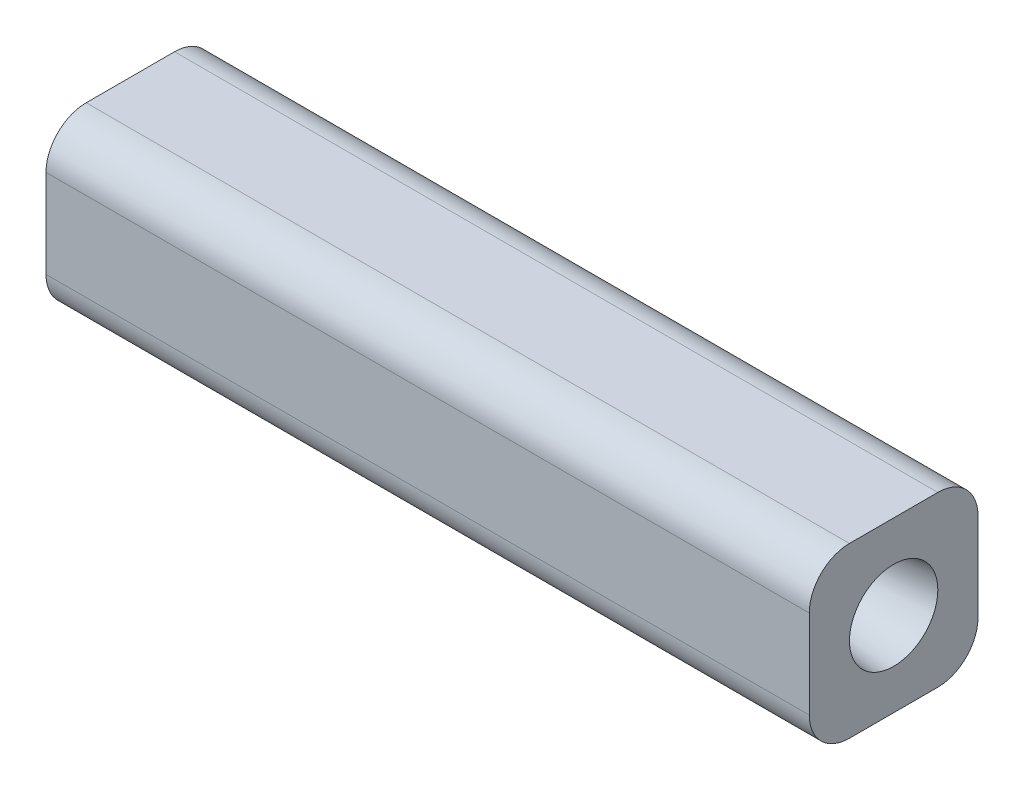
ISO-10303-21;
HEADER;
FILE_DESCRIPTION(('STEP AP214'),'2;1');
FILE_NAME('part.step','',(''),(''),'','','');
FILE_SCHEMA(('AUTOMOTIVE_DESIGN { 1 0 10303 214 1 1 1 1 }'));
ENDSEC;
DATA;
#1=APPLICATION_CONTEXT('core data for automotive mechanical design processes');
#2=APPLICATION_PROTOCOL_DEFINITION('international standard','automotive_design',2000,#1);
#3=PRODUCT_CONTEXT('',#1,'mechanical');
#4=PRODUCT('Part','Part','',(#3));
#5=PRODUCT_RELATED_PRODUCT_CATEGORY('part','',(#4));
#6=PRODUCT_DEFINITION_FORMATION('','',#4);
#7=PRODUCT_DEFINITION_CONTEXT('part definition',#1,'design');
#8=PRODUCT_DEFINITION('design','',#6,#7);
#9=PRODUCT_DEFINITION_SHAPE('','',#8);
#10=(LENGTH_UNIT() NAMED_UNIT(*) SI_UNIT(.MILLI.,.METRE.));
#11=(NAMED_UNIT(*) PLANE_ANGLE_UNIT() SI_UNIT($,.RADIAN.));
#12=(NAMED_UNIT(*) SI_UNIT($,.STERADIAN.) SOLID_ANGLE_UNIT());
#13=UNCERTAINTY_MEASURE_WITH_UNIT(LENGTH_MEASURE(1.E-05),#10,'distance_accuracy_value','');
#14=(GEOMETRIC_REPRESENTATION_CONTEXT(3) GLOBAL_UNCERTAINTY_ASSIGNED_CONTEXT((#13)) GLOBAL_UNIT_ASSIGNED_CONTEXT((#10,
#11,#12)) REPRESENTATION_CONTEXT('',''));
#15=CARTESIAN_POINT('',(0.,0.,0.));
#16=DIRECTION('',(0.,0.,1.));
#17=DIRECTION('',(1.,0.,0.));
#18=AXIS2_PLACEMENT_3D('',#15,#16,#17);
#19=CARTESIAN_POINT('',(19.,3.2,0.999999999999999));
#20=DIRECTION('',(-1.,0.,0.));
#21=DIRECTION('',(0.,0.,1.));
#22=AXIS2_PLACEMENT_3D('',#19,#20,#21);
#23=CYLINDRICAL_SURFACE('',#22,1.);
#24=CARTESIAN_POINT('',(0.,3.2,0.999999999999999));
#25=DIRECTION('',(1.,0.,0.));
#26=DIRECTION('',(0.,0.,-1.));
#27=AXIS2_PLACEMENT_3D('',#24,#25,#26);
#28=CIRCLE('',#27,1.);
#29=CARTESIAN_POINT('',(0.,3.2,0.));
#30=VERTEX_POINT('',#29);
#31=CARTESIAN_POINT('',(0.,4.2,0.999999999999999));
#32=VERTEX_POINT('',#31);
#33=EDGE_CURVE('E136',#30,#32,#28,.T.);
#34=ORIENTED_EDGE('',*,*,#33,.T.);
#35=DIRECTION('',(-1.,0.,0.));
#36=VECTOR('',#35,1.);
#37=CARTESIAN_POINT('',(19.,4.2,0.999999999999999));
#38=LINE('',#37,#36);
#39=CARTESIAN_POINT('',(19.,4.2,0.999999999999999));
#40=VERTEX_POINT('',#39);
#41=EDGE_CURVE('E11',#40,#32,#38,.T.);
#42=ORIENTED_EDGE('',*,*,#41,.F.);
#43=CARTESIAN_POINT('',(19.,3.2,0.999999999999999));
#44=DIRECTION('',(1.,0.,0.));
#45=DIRECTION('',(0.,0.,-1.));
#46=AXIS2_PLACEMENT_3D('',#43,#44,#45);
#47=CIRCLE('',#46,1.);
#48=CARTESIAN_POINT('',(19.,3.2,0.));
#49=VERTEX_POINT('',#48);
#50=EDGE_CURVE('E156',#49,#40,#47,.T.);
#51=ORIENTED_EDGE('',*,*,#50,.F.);
#52=DIRECTION('',(-1.,0.,0.));
#53=VECTOR('',#52,1.);
#54=CARTESIAN_POINT('',(19.,3.2,0.));
#55=LINE('',#54,#53);
#56=EDGE_CURVE('E132',#49,#30,#55,.T.);
#57=ORIENTED_EDGE('',*,*,#56,.T.);
#58=EDGE_LOOP('',(#34,#42,#51,#57));
#59=FACE_BOUND('',#58,.T.);
#60=ADVANCED_FACE('F41',(#59),#23,.T.);
#61=CARTESIAN_POINT('',(19.,4.2,0.999999999999999));
#62=DIRECTION('',(0.,-1.,0.));
#63=DIRECTION('',(0.,0.,-1.));
#64=AXIS2_PLACEMENT_3D('',#61,#62,#63);
#65=PLANE('',#64);
#66=DIRECTION('',(0.,0.,1.));
#67=VECTOR('',#66,1.);
#68=CARTESIAN_POINT('',(0.,4.2,0.999999999999999));
#69=LINE('',#68,#67);
#70=CARTESIAN_POINT('',(0.,4.2,3.2));
#71=VERTEX_POINT('',#70);
#72=EDGE_CURVE('E139',#32,#71,#69,.T.);
#73=ORIENTED_EDGE('',*,*,#72,.T.);
#74=DIRECTION('',(-1.,0.,0.));
#75=VECTOR('',#74,1.);
#76=CARTESIAN_POINT('',(19.,4.2,3.2));
#77=LINE('',#76,#75);
#78=CARTESIAN_POINT('',(19.,4.2,3.2));
#79=VERTEX_POINT('',#78);
#80=EDGE_CURVE('E49',#79,#71,#77,.T.);
#81=ORIENTED_EDGE('',*,*,#80,.F.);
#82=DIRECTION('',(0.,0.,1.));
#83=VECTOR('',#82,1.);
#84=CARTESIAN_POINT('',(19.,4.2,0.999999999999999));
#85=LINE('',#84,#83);
#86=EDGE_CURVE('E96',#40,#79,#85,.T.);
#87=ORIENTED_EDGE('',*,*,#86,.F.);
#88=ORIENTED_EDGE('',*,*,#41,.T.);
#89=EDGE_LOOP('',(#73,#81,#87,#88));
#90=FACE_BOUND('',#89,.T.);
#91=ADVANCED_FACE('F169',(#90),#65,.F.);
#92=CARTESIAN_POINT('',(19.,3.2,3.2));
#93=DIRECTION('',(-1.,0.,0.));
#94=DIRECTION('',(0.,0.,1.));
#95=AXIS2_PLACEMENT_3D('',#92,#93,#94);
#96=CYLINDRICAL_SURFACE('',#95,1.);
#97=CARTESIAN_POINT('',(0.,3.2,3.2));
#98=DIRECTION('',(-1.,0.,0.));
#99=DIRECTION('',(0.,0.,1.));
#100=AXIS2_PLACEMENT_3D('',#97,#98,#99);
#101=CIRCLE('',#100,1.);
#102=CARTESIAN_POINT('',(0.,3.2,4.2));
#103=VERTEX_POINT('',#102);
#104=EDGE_CURVE('E143',#103,#71,#101,.T.);
#105=ORIENTED_EDGE('',*,*,#104,.F.);
#106=DIRECTION('',(-1.,0.,0.));
#107=VECTOR('',#106,1.);
#108=CARTESIAN_POINT('',(19.,3.2,4.2));
#109=LINE('',#108,#107);
#110=CARTESIAN_POINT('',(19.,3.2,4.2));
#111=VERTEX_POINT('',#110);
#112=EDGE_CURVE('E162',#111,#103,#109,.T.);
#113=ORIENTED_EDGE('',*,*,#112,.F.);
#114=CARTESIAN_POINT('',(19.,3.2,3.2));
#115=DIRECTION('',(-1.,0.,0.));
#116=DIRECTION('',(0.,0.,1.));
#117=AXIS2_PLACEMENT_3D('',#114,#115,#116);
#118=CIRCLE('',#117,1.);
#119=EDGE_CURVE('E168',#111,#79,#118,.T.);
#120=ORIENTED_EDGE('',*,*,#119,.T.);
#121=ORIENTED_EDGE('',*,*,#80,.T.);
#122=EDGE_LOOP('',(#105,#113,#120,#121));
#123=FACE_BOUND('',#122,.T.);
#124=ADVANCED_FACE('F166',(#123),#96,.T.);
#125=CARTESIAN_POINT('',(19.,1.,4.2));
#126=DIRECTION('',(0.,0.,1.));
#127=DIRECTION('',(0.,-1.,0.));
#128=AXIS2_PLACEMENT_3D('',#125,#126,#127);
#129=PLANE('',#128);
#130=DIRECTION('',(0.,1.,0.));
#131=VECTOR('',#130,1.);
#132=CARTESIAN_POINT('',(0.,1.,4.2));
#133=LINE('',#132,#131);
#134=CARTESIAN_POINT('',(0.,1.,4.2));
#135=VERTEX_POINT('',#134);
#136=EDGE_CURVE('E146',#135,#103,#133,.T.);
#137=ORIENTED_EDGE('',*,*,#136,.F.);
#138=DIRECTION('',(-1.,0.,0.));
#139=VECTOR('',#138,1.);
#140=CARTESIAN_POINT('',(19.,1.,4.2));
#141=LINE('',#140,#139);
#142=CARTESIAN_POINT('',(19.,1.,4.2));
#143=VERTEX_POINT('',#142);
#144=EDGE_CURVE('E160',#143,#135,#141,.T.);
#145=ORIENTED_EDGE('',*,*,#144,.F.);
#146=DIRECTION('',(0.,1.,0.));
#147=VECTOR('',#146,1.);
#148=CARTESIAN_POINT('',(19.,1.,4.2));
#149=LINE('',#148,#147);
#150=EDGE_CURVE('E179',#143,#111,#149,.T.);
#151=ORIENTED_EDGE('',*,*,#150,.T.);
#152=ORIENTED_EDGE('',*,*,#112,.T.);
#153=EDGE_LOOP('',(#137,#145,#151,#152));
#154=FACE_BOUND('',#153,.T.);
#155=ADVANCED_FACE('F177',(#154),#129,.T.);
#156=CARTESIAN_POINT('',(19.,1.,3.2));
#157=DIRECTION('',(-1.,0.,0.));
#158=DIRECTION('',(0.,0.,1.));
#159=AXIS2_PLACEMENT_3D('',#156,#157,#158);
#160=CYLINDRICAL_SURFACE('',#159,1.);
#161=CARTESIAN_POINT('',(0.,1.,3.2));
#162=DIRECTION('',(-1.,0.,0.));
#163=DIRECTION('',(0.,0.,1.));
#164=AXIS2_PLACEMENT_3D('',#161,#162,#163);
#165=CIRCLE('',#164,1.);
#166=CARTESIAN_POINT('',(0.,0.,3.2));
#167=VERTEX_POINT('',#166);
#168=EDGE_CURVE('E149',#167,#135,#165,.T.);
#169=ORIENTED_EDGE('',*,*,#168,.F.);
#170=DIRECTION('',(-1.,0.,0.));
#171=VECTOR('',#170,1.);
#172=CARTESIAN_POINT('',(19.,0.,3.2));
#173=LINE('',#172,#171);
#174=CARTESIAN_POINT('',(19.,0.,3.2));
#175=VERTEX_POINT('',#174);
#176=EDGE_CURVE('E121',#175,#167,#173,.T.);
#177=ORIENTED_EDGE('',*,*,#176,.F.);
#178=CARTESIAN_POINT('',(19.,1.,3.2));
#179=DIRECTION('',(-1.,0.,0.));
#180=DIRECTION('',(0.,0.,1.));
#181=AXIS2_PLACEMENT_3D('',#178,#179,#180);
#182=CIRCLE('',#181,1.);
#183=EDGE_CURVE('E128',#175,#143,#182,.T.);
#184=ORIENTED_EDGE('',*,*,#183,.T.);
#185=ORIENTED_EDGE('',*,*,#144,.T.);
#186=EDGE_LOOP('',(#169,#177,#184,#185));
#187=FACE_BOUND('',#186,.T.);
#188=ADVANCED_FACE('F185',(#187),#160,.T.);
#189=CARTESIAN_POINT('',(19.,0.,1.00000000000001));
#190=DIRECTION('',(0.,-1.,0.));
#191=DIRECTION('',(0.,0.,-1.));
#192=AXIS2_PLACEMENT_3D('',#189,#190,#191);
#193=PLANE('',#192);
#194=DIRECTION('',(0.,0.,1.));
#195=VECTOR('',#194,1.);
#196=CARTESIAN_POINT('',(0.,0.,1.00000000000001));
#197=LINE('',#196,#195);
#198=CARTESIAN_POINT('',(0.,0.,1.00000000000001));
#199=VERTEX_POINT('',#198);
#200=EDGE_CURVE('E116',#199,#167,#197,.T.);
#201=ORIENTED_EDGE('',*,*,#200,.F.);
#202=DIRECTION('',(-1.,0.,0.));
#203=VECTOR('',#202,1.);
#204=CARTESIAN_POINT('',(19.,0.,1.00000000000001));
#205=LINE('',#204,#203);
#206=CARTESIAN_POINT('',(19.,0.,1.00000000000001));
#207=VERTEX_POINT('',#206);
#208=EDGE_CURVE('E111',#207,#199,#205,.T.);
#209=ORIENTED_EDGE('',*,*,#208,.F.);
#210=DIRECTION('',(0.,0.,1.));
#211=VECTOR('',#210,1.);
#212=CARTESIAN_POINT('',(19.,0.,1.00000000000001));
#213=LINE('',#212,#211);
#214=EDGE_CURVE('E114',#207,#175,#213,.T.);
#215=ORIENTED_EDGE('',*,*,#214,.T.);
#216=ORIENTED_EDGE('',*,*,#176,.T.);
#217=EDGE_LOOP('',(#201,#209,#215,#216));
#218=FACE_BOUND('',#217,.T.);
#219=ADVANCED_FACE('F113',(#218),#193,.T.);
#220=CARTESIAN_POINT('',(19.,1.,1.));
#221=DIRECTION('',(-1.,0.,0.));
#222=DIRECTION('',(0.,0.,1.));
#223=AXIS2_PLACEMENT_3D('',#220,#221,#222);
#224=CYLINDRICAL_SURFACE('',#223,1.);
#225=CARTESIAN_POINT('',(0.,1.,1.));
#226=DIRECTION('',(-1.,0.,0.));
#227=DIRECTION('',(0.,0.,1.));
#228=AXIS2_PLACEMENT_3D('',#225,#226,#227);
#229=CIRCLE('',#228,1.);
#230=CARTESIAN_POINT('',(0.,1.00000000000001,0.));
#231=VERTEX_POINT('',#230);
#232=EDGE_CURVE('E153',#231,#199,#229,.T.);
#233=ORIENTED_EDGE('',*,*,#232,.F.);
#234=DIRECTION('',(-1.,0.,0.));
#235=VECTOR('',#234,1.);
#236=CARTESIAN_POINT('',(19.,1.00000000000001,0.));
#237=LINE('',#236,#235);
#238=CARTESIAN_POINT('',(19.,1.00000000000001,0.));
#239=VERTEX_POINT('',#238);
#240=EDGE_CURVE('E85',#239,#231,#237,.T.);
#241=ORIENTED_EDGE('',*,*,#240,.F.);
#242=CARTESIAN_POINT('',(19.,1.,1.));
#243=DIRECTION('',(-1.,0.,0.));
#244=DIRECTION('',(0.,0.,1.));
#245=AXIS2_PLACEMENT_3D('',#242,#243,#244);
#246=CIRCLE('',#245,1.);
#247=EDGE_CURVE('E125',#239,#207,#246,.T.);
#248=ORIENTED_EDGE('',*,*,#247,.T.);
#249=ORIENTED_EDGE('',*,*,#208,.T.);
#250=EDGE_LOOP('',(#233,#241,#248,#249));
#251=FACE_BOUND('',#250,.T.);
#252=ADVANCED_FACE('F130',(#251),#224,.T.);
#253=CARTESIAN_POINT('',(19.,1.00000000000001,0.));
#254=DIRECTION('',(0.,0.,1.));
#255=DIRECTION('',(0.,-1.,0.));
#256=AXIS2_PLACEMENT_3D('',#253,#254,#255);
#257=PLANE('',#256);
#258=DIRECTION('',(0.,1.,0.));
#259=VECTOR('',#258,1.);
#260=CARTESIAN_POINT('',(0.,1.00000000000001,0.));
#261=LINE('',#260,#259);
#262=EDGE_CURVE('E88',#231,#30,#261,.T.);
#263=ORIENTED_EDGE('',*,*,#262,.T.);
#264=ORIENTED_EDGE('',*,*,#56,.F.);
#265=DIRECTION('',(0.,1.,0.));
#266=VECTOR('',#265,1.);
#267=CARTESIAN_POINT('',(19.,1.00000000000001,0.));
#268=LINE('',#267,#266);
#269=EDGE_CURVE('E57',#239,#49,#268,.T.);
#270=ORIENTED_EDGE('',*,*,#269,.F.);
#271=ORIENTED_EDGE('',*,*,#240,.T.);
#272=EDGE_LOOP('',(#263,#264,#270,#271));
#273=FACE_BOUND('',#272,.T.);
#274=ADVANCED_FACE('F188',(#273),#257,.F.);
#275=CARTESIAN_POINT('',(19.,3.2,0.999999999999999));
#276=DIRECTION('',(1.,0.,0.));
#277=DIRECTION('',(0.,0.,-1.));
#278=AXIS2_PLACEMENT_3D('',#275,#276,#277);
#279=PLANE('',#278);
#280=CARTESIAN_POINT('',(19.,2.1,2.1));
#281=DIRECTION('',(1.,0.,0.));
#282=DIRECTION('',(0.,0.,-1.));
#283=AXIS2_PLACEMENT_3D('',#280,#281,#282);
#284=CIRCLE('',#283,1.1);
#285=CARTESIAN_POINT('',(19.,2.1,1.));
#286=VERTEX_POINT('',#285);
#287=EDGE_CURVE('E288',#286,#286,#284,.T.);
#288=ORIENTED_EDGE('',*,*,#287,.F.);
#289=EDGE_LOOP('',(#288));
#290=FACE_BOUND('',#289,.T.);
#291=ORIENTED_EDGE('',*,*,#50,.T.);
#292=ORIENTED_EDGE('',*,*,#86,.T.);
#293=ORIENTED_EDGE('',*,*,#119,.F.);
#294=ORIENTED_EDGE('',*,*,#150,.F.);
#295=ORIENTED_EDGE('',*,*,#183,.F.);
#296=ORIENTED_EDGE('',*,*,#214,.F.);
#297=ORIENTED_EDGE('',*,*,#247,.F.);
#298=ORIENTED_EDGE('',*,*,#269,.T.);
#299=EDGE_LOOP('',(#291,#292,#293,#294,#295,#296,#297,#298));
#300=FACE_BOUND('',#299,.T.);
#301=ADVANCED_FACE('F124',(#290,#300),#279,.T.);
#302=CARTESIAN_POINT('',(0.,3.2,0.999999999999999));
#303=DIRECTION('',(1.,0.,0.));
#304=DIRECTION('',(0.,0.,-1.));
#305=AXIS2_PLACEMENT_3D('',#302,#303,#304);
#306=PLANE('',#305);
#307=CARTESIAN_POINT('',(0.,2.1,2.1));
#308=DIRECTION('',(1.,0.,0.));
#309=DIRECTION('',(0.,0.,-1.));
#310=AXIS2_PLACEMENT_3D('',#307,#308,#309);
#311=CIRCLE('',#310,1.1);
#312=CARTESIAN_POINT('',(0.,2.1,1.));
#313=VERTEX_POINT('',#312);
#314=EDGE_CURVE('E287',#313,#313,#311,.T.);
#315=ORIENTED_EDGE('',*,*,#314,.T.);
#316=EDGE_LOOP('',(#315));
#317=FACE_BOUND('',#316,.T.);
#318=ORIENTED_EDGE('',*,*,#33,.F.);
#319=ORIENTED_EDGE('',*,*,#262,.F.);
#320=ORIENTED_EDGE('',*,*,#232,.T.);
#321=ORIENTED_EDGE('',*,*,#200,.T.);
#322=ORIENTED_EDGE('',*,*,#168,.T.);
#323=ORIENTED_EDGE('',*,*,#136,.T.);
#324=ORIENTED_EDGE('',*,*,#104,.T.);
#325=ORIENTED_EDGE('',*,*,#72,.F.);
#326=EDGE_LOOP('',(#318,#319,#320,#321,#322,#323,#324,#325));
#327=FACE_BOUND('',#326,.T.);
#328=ADVANCED_FACE('F173',(#317,#327),#306,.F.);
#329=CARTESIAN_POINT('',(0.,2.1,2.1));
#330=DIRECTION('',(-1.,0.,0.));
#331=DIRECTION('',(0.,0.,-1.));
#332=AXIS2_PLACEMENT_3D('',#329,#330,#331);
#333=CONICAL_SURFACE('',#332,1.1,0.10471975511966);
#334=CARTESIAN_POINT('',(5.,2.1,2.1));
#335=DIRECTION('',(1.,0.,0.));
#336=DIRECTION('',(0.,0.,-1.));
#337=AXIS2_PLACEMENT_3D('',#334,#335,#336);
#338=CIRCLE('',#337,0.574478823671615);
#339=CARTESIAN_POINT('',(5.,2.1,1.52552117632838));
#340=VERTEX_POINT('',#339);
#341=EDGE_CURVE('E140',#340,#340,#338,.T.);
#342=ORIENTED_EDGE('',*,*,#341,.T.);
#343=EDGE_LOOP('',(#342));
#344=FACE_BOUND('',#343,.T.);
#345=ORIENTED_EDGE('',*,*,#314,.F.);
#346=EDGE_LOOP('',(#345));
#347=FACE_BOUND('',#346,.T.);
#348=ADVANCED_FACE('F244',(#344,#347),#333,.F.);
#349=CARTESIAN_POINT('',(5.,2.1,2.1));
#350=DIRECTION('',(1.,0.,0.));
#351=DIRECTION('',(0.,0.,-1.));
#352=AXIS2_PLACEMENT_3D('',#349,#350,#351);
#353=PLANE('',#352);
#354=ORIENTED_EDGE('',*,*,#341,.F.);
#355=EDGE_LOOP('',(#354));
#356=FACE_BOUND('',#355,.T.);
#357=ADVANCED_FACE('F253',(#356),#353,.F.);
#358=CARTESIAN_POINT('',(19.,2.1,2.1));
#359=DIRECTION('',(1.,0.,0.));
#360=DIRECTION('',(0.,0.,-1.));
#361=AXIS2_PLACEMENT_3D('',#358,#359,#360);
#362=CONICAL_SURFACE('',#361,1.1,0.10471975511966);
#363=CARTESIAN_POINT('',(14.,2.1,2.1));
#364=DIRECTION('',(-1.,0.,0.));
#365=DIRECTION('',(0.,0.,1.));
#366=AXIS2_PLACEMENT_3D('',#363,#364,#365);
#367=CIRCLE('',#366,0.574478823671615);
#368=CARTESIAN_POINT('',(14.,2.1,2.67447882367161));
#369=VERTEX_POINT('',#368);
#370=EDGE_CURVE('E286',#369,#369,#367,.F.);
#371=ORIENTED_EDGE('',*,*,#370,.F.);
#372=EDGE_LOOP('',(#371));
#373=FACE_BOUND('',#372,.T.);
#374=ORIENTED_EDGE('',*,*,#287,.T.);
#375=EDGE_LOOP('',(#374));
#376=FACE_BOUND('',#375,.T.);
#377=ADVANCED_FACE('F262',(#373,#376),#362,.F.);
#378=CARTESIAN_POINT('',(14.,2.1,2.1));
#379=DIRECTION('',(-1.,0.,0.));
#380=DIRECTION('',(0.,0.,-1.));
#381=AXIS2_PLACEMENT_3D('',#378,#379,#380);
#382=PLANE('',#381);
#383=ORIENTED_EDGE('',*,*,#370,.T.);
#384=EDGE_LOOP('',(#383));
#385=FACE_BOUND('',#384,.T.);
#386=ADVANCED_FACE('F271',(#385),#382,.F.);
#387=CLOSED_SHELL('',(#60,#91,#124,#155,#188,#219,#252,#274,#301,#328,#348,#357,#377,#386));
#388=MANIFOLD_SOLID_BREP('B2',#387);
#389=ADVANCED_BREP_SHAPE_REPRESENTATION('',(#18,#388),#14);
#390=SHAPE_DEFINITION_REPRESENTATION(#9,#389);
ENDSEC;
END-ISO-10303-21;
